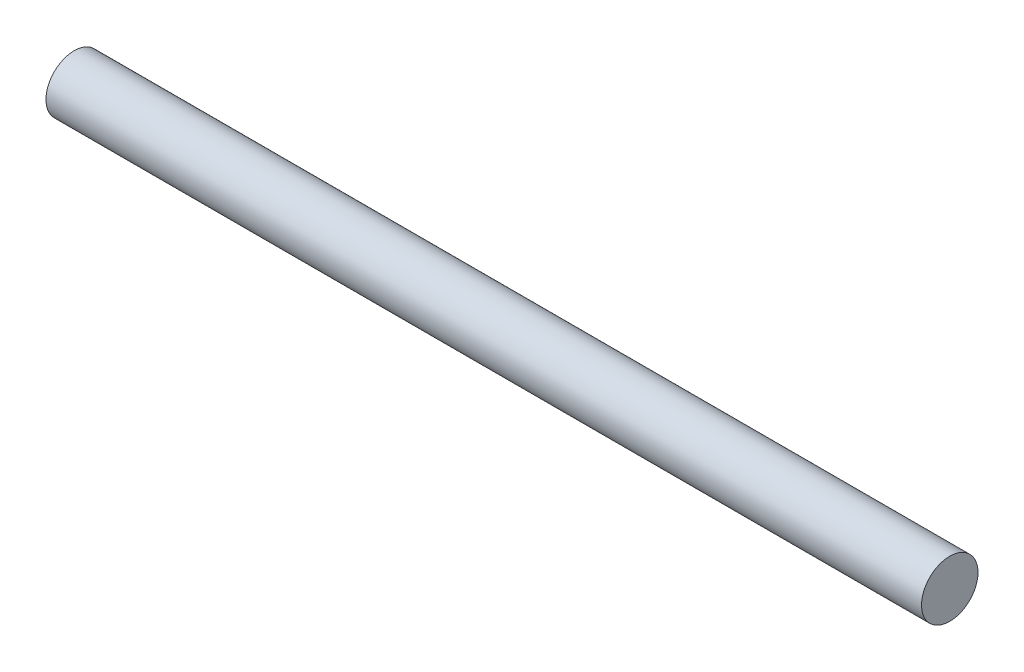
ISO-10303-21;
HEADER;
FILE_DESCRIPTION(('STEP AP214'),'2;1');
FILE_NAME('part.step','',(''),(''),'','','');
FILE_SCHEMA(('AUTOMOTIVE_DESIGN { 1 0 10303 214 1 1 1 1 }'));
ENDSEC;
DATA;
#1=APPLICATION_CONTEXT('core data for automotive mechanical design processes');
#2=APPLICATION_PROTOCOL_DEFINITION('international standard','automotive_design',2000,#1);
#3=PRODUCT_CONTEXT('',#1,'mechanical');
#4=PRODUCT('Part','Part','',(#3));
#5=PRODUCT_RELATED_PRODUCT_CATEGORY('part','',(#4));
#6=PRODUCT_DEFINITION_FORMATION('','',#4);
#7=PRODUCT_DEFINITION_CONTEXT('part definition',#1,'design');
#8=PRODUCT_DEFINITION('design','',#6,#7);
#9=PRODUCT_DEFINITION_SHAPE('','',#8);
#10=(LENGTH_UNIT() NAMED_UNIT(*) SI_UNIT(.MILLI.,.METRE.));
#11=(NAMED_UNIT(*) PLANE_ANGLE_UNIT() SI_UNIT($,.RADIAN.));
#12=(NAMED_UNIT(*) SI_UNIT($,.STERADIAN.) SOLID_ANGLE_UNIT());
#13=UNCERTAINTY_MEASURE_WITH_UNIT(LENGTH_MEASURE(1.E-05),#10,'distance_accuracy_value','');
#14=(GEOMETRIC_REPRESENTATION_CONTEXT(3) GLOBAL_UNCERTAINTY_ASSIGNED_CONTEXT((#13)) GLOBAL_UNIT_ASSIGNED_CONTEXT((#10,
#11,#12)) REPRESENTATION_CONTEXT('',''));
#15=CARTESIAN_POINT('',(0.,0.,0.));
#16=DIRECTION('',(0.,0.,1.));
#17=DIRECTION('',(1.,0.,0.));
#18=AXIS2_PLACEMENT_3D('',#15,#16,#17);
#19=CARTESIAN_POINT('',(310.,0.,0.));
#20=DIRECTION('',(-1.,0.,0.));
#21=DIRECTION('',(0.,0.,1.));
#22=AXIS2_PLACEMENT_3D('',#19,#20,#21);
#23=CYLINDRICAL_SURFACE('',#22,10.);
#24=CARTESIAN_POINT('',(310.,0.,0.));
#25=DIRECTION('',(1.,0.,0.));
#26=DIRECTION('',(0.,0.,-1.));
#27=AXIS2_PLACEMENT_3D('',#24,#25,#26);
#28=CIRCLE('',#27,10.);
#29=CARTESIAN_POINT('',(310.,0.,-10.));
#30=VERTEX_POINT('',#29);
#31=EDGE_CURVE('E10',#30,#30,#28,.T.);
#32=ORIENTED_EDGE('',*,*,#31,.F.);
#33=EDGE_LOOP('',(#32));
#34=FACE_BOUND('',#33,.T.);
#35=CARTESIAN_POINT('',(0.,0.,0.));
#36=DIRECTION('',(1.,0.,0.));
#37=DIRECTION('',(0.,0.,-1.));
#38=AXIS2_PLACEMENT_3D('',#35,#36,#37);
#39=CIRCLE('',#38,10.);
#40=CARTESIAN_POINT('',(0.,0.,-10.));
#41=VERTEX_POINT('',#40);
#42=EDGE_CURVE('E34',#41,#41,#39,.T.);
#43=ORIENTED_EDGE('',*,*,#42,.T.);
#44=EDGE_LOOP('',(#43));
#45=FACE_BOUND('',#44,.T.);
#46=ADVANCED_FACE('F31',(#34,#45),#23,.T.);
#47=CARTESIAN_POINT('',(310.,0.,0.));
#48=DIRECTION('',(1.,0.,0.));
#49=DIRECTION('',(0.,0.,-1.));
#50=AXIS2_PLACEMENT_3D('',#47,#48,#49);
#51=PLANE('',#50);
#52=ORIENTED_EDGE('',*,*,#31,.T.);
#53=EDGE_LOOP('',(#52));
#54=FACE_BOUND('',#53,.T.);
#55=ADVANCED_FACE('F46',(#54),#51,.T.);
#56=CARTESIAN_POINT('',(0.,0.,0.));
#57=DIRECTION('',(1.,0.,0.));
#58=DIRECTION('',(0.,0.,-1.));
#59=AXIS2_PLACEMENT_3D('',#56,#57,#58);
#60=PLANE('',#59);
#61=ORIENTED_EDGE('',*,*,#42,.F.);
#62=EDGE_LOOP('',(#61));
#63=FACE_BOUND('',#62,.T.);
#64=ADVANCED_FACE('F44',(#63),#60,.F.);
#65=CLOSED_SHELL('',(#46,#55,#64));
#66=MANIFOLD_SOLID_BREP('B2',#65);
#67=ADVANCED_BREP_SHAPE_REPRESENTATION('',(#18,#66),#14);
#68=SHAPE_DEFINITION_REPRESENTATION(#9,#67);
ENDSEC;
END-ISO-10303-21;
